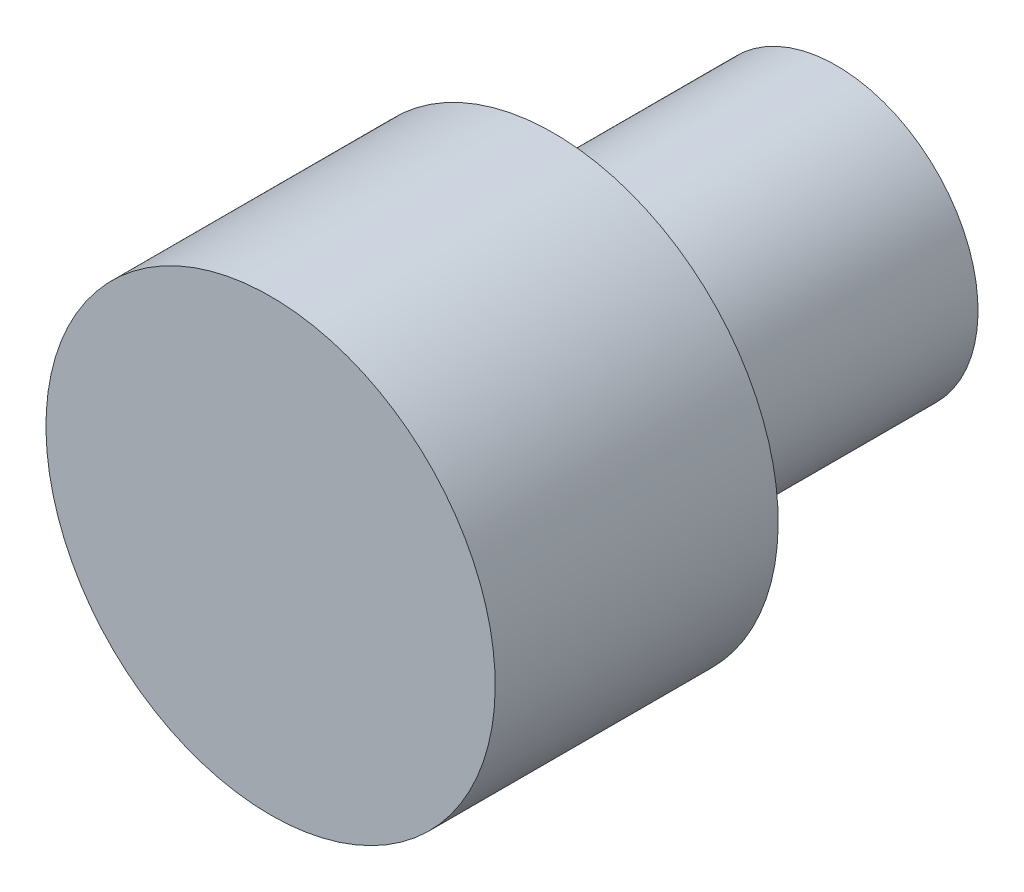
ISO-10303-21;
HEADER;
FILE_DESCRIPTION(('STEP AP214'),'2;1');
FILE_NAME('part.step','',(''),(''),'','','');
FILE_SCHEMA(('AUTOMOTIVE_DESIGN { 1 0 10303 214 1 1 1 1 }'));
ENDSEC;
DATA;
#1=APPLICATION_CONTEXT('core data for automotive mechanical design processes');
#2=APPLICATION_PROTOCOL_DEFINITION('international standard','automotive_design',2000,#1);
#3=PRODUCT_CONTEXT('',#1,'mechanical');
#4=PRODUCT('Part','Part','',(#3));
#5=PRODUCT_RELATED_PRODUCT_CATEGORY('part','',(#4));
#6=PRODUCT_DEFINITION_FORMATION('','',#4);
#7=PRODUCT_DEFINITION_CONTEXT('part definition',#1,'design');
#8=PRODUCT_DEFINITION('design','',#6,#7);
#9=PRODUCT_DEFINITION_SHAPE('','',#8);
#10=(LENGTH_UNIT() NAMED_UNIT(*) SI_UNIT(.MILLI.,.METRE.));
#11=(NAMED_UNIT(*) PLANE_ANGLE_UNIT() SI_UNIT($,.RADIAN.));
#12=(NAMED_UNIT(*) SI_UNIT($,.STERADIAN.) SOLID_ANGLE_UNIT());
#13=UNCERTAINTY_MEASURE_WITH_UNIT(LENGTH_MEASURE(1.E-05),#10,'distance_accuracy_value','');
#14=(GEOMETRIC_REPRESENTATION_CONTEXT(3) GLOBAL_UNCERTAINTY_ASSIGNED_CONTEXT((#13)) GLOBAL_UNIT_ASSIGNED_CONTEXT((#10,
#11,#12)) REPRESENTATION_CONTEXT('',''));
#15=CARTESIAN_POINT('',(0.,0.,0.));
#16=DIRECTION('',(0.,0.,1.));
#17=DIRECTION('',(1.,0.,0.));
#18=AXIS2_PLACEMENT_3D('',#15,#16,#17);
#19=CARTESIAN_POINT('',(0.,0.,0.));
#20=DIRECTION('',(0.,0.,-1.));
#21=DIRECTION('',(0.,1.,0.));
#22=AXIS2_PLACEMENT_3D('',#19,#20,#21);
#23=PLANE('',#22);
#24=CARTESIAN_POINT('',(0.,0.,0.));
#25=DIRECTION('',(0.,0.,1.));
#26=DIRECTION('',(0.,-1.,0.));
#27=AXIS2_PLACEMENT_3D('',#24,#25,#26);
#28=CIRCLE('',#27,6.35);
#29=CARTESIAN_POINT('',(0.,-6.35,0.));
#30=VERTEX_POINT('',#29);
#31=EDGE_CURVE('E10',#30,#30,#28,.T.);
#32=ORIENTED_EDGE('',*,*,#31,.T.);
#33=EDGE_LOOP('',(#32));
#34=FACE_BOUND('',#33,.T.);
#35=ADVANCED_FACE('F37',(#34),#23,.F.);
#36=CARTESIAN_POINT('',(0.,0.,0.));
#37=DIRECTION('',(0.,0.,1.));
#38=DIRECTION('',(0.,-1.,0.));
#39=AXIS2_PLACEMENT_3D('',#36,#37,#38);
#40=CYLINDRICAL_SURFACE('',#39,6.35);
#41=ORIENTED_EDGE('',*,*,#31,.F.);
#42=EDGE_LOOP('',(#41));
#43=FACE_BOUND('',#42,.T.);
#44=CARTESIAN_POINT('',(0.,0.,-8.));
#45=DIRECTION('',(0.,0.,1.));
#46=DIRECTION('',(0.,-1.,0.));
#47=AXIS2_PLACEMENT_3D('',#44,#45,#46);
#48=CIRCLE('',#47,6.35);
#49=CARTESIAN_POINT('',(0.,-6.35,-8.));
#50=VERTEX_POINT('',#49);
#51=EDGE_CURVE('E43',#50,#50,#48,.T.);
#52=ORIENTED_EDGE('',*,*,#51,.T.);
#53=EDGE_LOOP('',(#52));
#54=FACE_BOUND('',#53,.T.);
#55=ADVANCED_FACE('F69',(#43,#54),#40,.T.);
#56=CARTESIAN_POINT('',(0.,6.35,-8.));
#57=DIRECTION('',(0.,0.,1.));
#58=DIRECTION('',(0.,-1.,0.));
#59=AXIS2_PLACEMENT_3D('',#56,#57,#58);
#60=PLANE('',#59);
#61=ORIENTED_EDGE('',*,*,#51,.F.);
#62=EDGE_LOOP('',(#61));
#63=FACE_BOUND('',#62,.T.);
#64=CARTESIAN_POINT('',(0.,0.,-8.));
#65=DIRECTION('',(0.,0.,1.));
#66=DIRECTION('',(0.,-1.,0.));
#67=AXIS2_PLACEMENT_3D('',#64,#65,#66);
#68=CIRCLE('',#67,4.);
#69=CARTESIAN_POINT('',(0.,-4.,-8.));
#70=VERTEX_POINT('',#69);
#71=EDGE_CURVE('E47',#70,#70,#68,.T.);
#72=ORIENTED_EDGE('',*,*,#71,.T.);
#73=EDGE_LOOP('',(#72));
#74=FACE_BOUND('',#73,.T.);
#75=ADVANCED_FACE('F65',(#63,#74),#60,.F.);
#76=CARTESIAN_POINT('',(0.,0.,0.));
#77=DIRECTION('',(0.,0.,1.));
#78=DIRECTION('',(0.,-1.,0.));
#79=AXIS2_PLACEMENT_3D('',#76,#77,#78);
#80=CYLINDRICAL_SURFACE('',#79,4.);
#81=ORIENTED_EDGE('',*,*,#71,.F.);
#82=EDGE_LOOP('',(#81));
#83=FACE_BOUND('',#82,.T.);
#84=CARTESIAN_POINT('',(0.,0.,-16.));
#85=DIRECTION('',(0.,0.,1.));
#86=DIRECTION('',(0.,-1.,0.));
#87=AXIS2_PLACEMENT_3D('',#84,#85,#86);
#88=CIRCLE('',#87,4.);
#89=CARTESIAN_POINT('',(0.,-4.,-16.));
#90=VERTEX_POINT('',#89);
#91=EDGE_CURVE('E51',#90,#90,#88,.T.);
#92=ORIENTED_EDGE('',*,*,#91,.T.);
#93=EDGE_LOOP('',(#92));
#94=FACE_BOUND('',#93,.T.);
#95=ADVANCED_FACE('F57',(#83,#94),#80,.T.);
#96=CARTESIAN_POINT('',(0.,4.,-16.));
#97=DIRECTION('',(0.,0.,1.));
#98=DIRECTION('',(0.,-1.,0.));
#99=AXIS2_PLACEMENT_3D('',#96,#97,#98);
#100=PLANE('',#99);
#101=ORIENTED_EDGE('',*,*,#91,.F.);
#102=EDGE_LOOP('',(#101));
#103=FACE_BOUND('',#102,.T.);
#104=ADVANCED_FACE('F59',(#103),#100,.F.);
#105=CLOSED_SHELL('',(#35,#55,#75,#95,#104));
#106=MANIFOLD_SOLID_BREP('B2',#105);
#107=ADVANCED_BREP_SHAPE_REPRESENTATION('',(#18,#106),#14);
#108=SHAPE_DEFINITION_REPRESENTATION(#9,#107);
ENDSEC;
END-ISO-10303-21;
